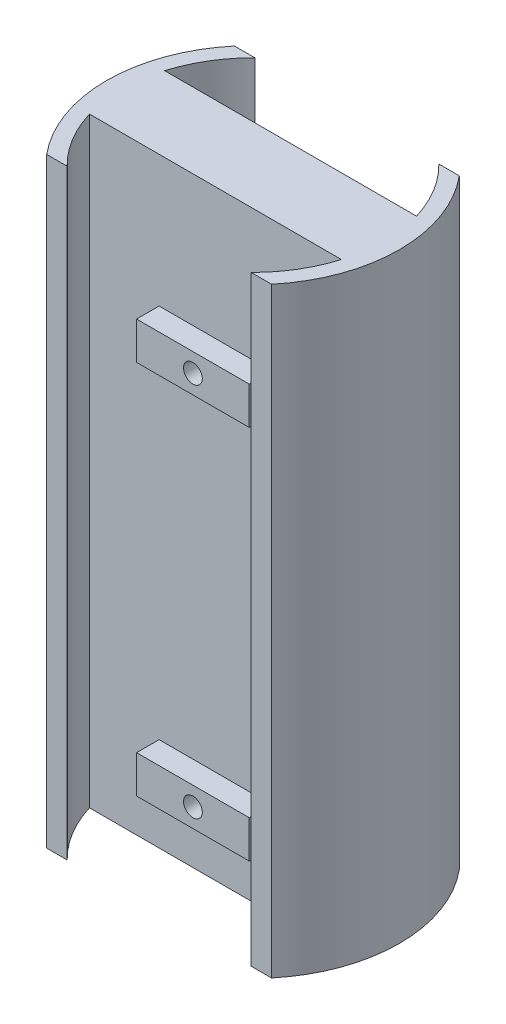
ISO-10303-21;
HEADER;
FILE_DESCRIPTION(('STEP AP214'),'2;1');
FILE_NAME('part.step','',(''),(''),'','','');
FILE_SCHEMA(('AUTOMOTIVE_DESIGN { 1 0 10303 214 1 1 1 1 }'));
ENDSEC;
DATA;
#1=APPLICATION_CONTEXT('core data for automotive mechanical design processes');
#2=APPLICATION_PROTOCOL_DEFINITION('international standard','automotive_design',2000,#1);
#3=PRODUCT_CONTEXT('',#1,'mechanical');
#4=PRODUCT('Part','Part','',(#3));
#5=PRODUCT_RELATED_PRODUCT_CATEGORY('part','',(#4));
#6=PRODUCT_DEFINITION_FORMATION('','',#4);
#7=PRODUCT_DEFINITION_CONTEXT('part definition',#1,'design');
#8=PRODUCT_DEFINITION('design','',#6,#7);
#9=PRODUCT_DEFINITION_SHAPE('','',#8);
#10=(LENGTH_UNIT() NAMED_UNIT(*) SI_UNIT(.MILLI.,.METRE.));
#11=(NAMED_UNIT(*) PLANE_ANGLE_UNIT() SI_UNIT($,.RADIAN.));
#12=(NAMED_UNIT(*) SI_UNIT($,.STERADIAN.) SOLID_ANGLE_UNIT());
#13=UNCERTAINTY_MEASURE_WITH_UNIT(LENGTH_MEASURE(1.E-05),#10,'distance_accuracy_value','');
#14=(GEOMETRIC_REPRESENTATION_CONTEXT(3) GLOBAL_UNCERTAINTY_ASSIGNED_CONTEXT((#13)) GLOBAL_UNIT_ASSIGNED_CONTEXT((#10,
#11,#12)) REPRESENTATION_CONTEXT('',''));
#15=CARTESIAN_POINT('',(0.,0.,0.));
#16=DIRECTION('',(0.,0.,1.));
#17=DIRECTION('',(1.,0.,0.));
#18=AXIS2_PLACEMENT_3D('',#15,#16,#17);
#19=CARTESIAN_POINT('',(49.53,-101.6,25.4));
#20=DIRECTION('',(0.,1.,0.));
#21=DIRECTION('',(0.,0.,1.));
#22=AXIS2_PLACEMENT_3D('',#19,#20,#21);
#23=PLANE('',#22);
#24=CARTESIAN_POINT('',(0.,-101.6,12.7));
#25=DIRECTION('',(0.,1.,0.));
#26=DIRECTION('',(0.,0.,1.));
#27=AXIS2_PLACEMENT_3D('',#24,#25,#26);
#28=CIRCLE('',#27,49.53);
#29=CARTESIAN_POINT('',(-38.0152390496232,-101.6,-19.05));
#30=VERTEX_POINT('',#29);
#31=CARTESIAN_POINT('',(-38.0152390496232,-101.6,44.45));
#32=VERTEX_POINT('',#31);
#33=EDGE_CURVE('E312',#30,#32,#28,.T.);
#34=ORIENTED_EDGE('',*,*,#33,.F.);
#35=DIRECTION('',(1.,0.,0.));
#36=VECTOR('',#35,1.);
#37=CARTESIAN_POINT('',(0.,-101.6,-19.05));
#38=LINE('',#37,#36);
#39=CARTESIAN_POINT('',(-31.1085197333464,-101.6,-19.05));
#40=VERTEX_POINT('',#39);
#41=EDGE_CURVE('E257',#30,#40,#38,.T.);
#42=ORIENTED_EDGE('',*,*,#41,.T.);
#43=CARTESIAN_POINT('',(0.,-101.6,12.7));
#44=DIRECTION('',(0.,1.,0.));
#45=DIRECTION('',(0.,0.,1.));
#46=AXIS2_PLACEMENT_3D('',#43,#44,#45);
#47=CIRCLE('',#46,44.45);
#48=CARTESIAN_POINT('',(-42.597094971371,-101.6,0.));
#49=VERTEX_POINT('',#48);
#50=EDGE_CURVE('E303',#40,#49,#47,.T.);
#51=ORIENTED_EDGE('',*,*,#50,.T.);
#52=DIRECTION('',(1.,0.,0.));
#53=VECTOR('',#52,1.);
#54=CARTESIAN_POINT('',(49.53,-101.6,0.));
#55=LINE('',#54,#53);
#56=CARTESIAN_POINT('',(42.597094971371,-101.6,0.));
#57=VERTEX_POINT('',#56);
#58=EDGE_CURVE('E330',#49,#57,#55,.T.);
#59=ORIENTED_EDGE('',*,*,#58,.T.);
#60=CARTESIAN_POINT('',(31.1085197333464,-101.6,-19.05));
#61=VERTEX_POINT('',#60);
#62=EDGE_CURVE('E305',#57,#61,#47,.T.);
#63=ORIENTED_EDGE('',*,*,#62,.T.);
#64=CARTESIAN_POINT('',(38.0152390496232,-101.6,-19.05));
#65=VERTEX_POINT('',#64);
#66=EDGE_CURVE('E262',#61,#65,#38,.T.);
#67=ORIENTED_EDGE('',*,*,#66,.T.);
#68=CARTESIAN_POINT('',(38.0152390496232,-101.6,44.45));
#69=VERTEX_POINT('',#68);
#70=EDGE_CURVE('E316',#69,#65,#28,.T.);
#71=ORIENTED_EDGE('',*,*,#70,.F.);
#72=DIRECTION('',(1.,0.,0.));
#73=VECTOR('',#72,1.);
#74=CARTESIAN_POINT('',(0.,-101.6,44.45));
#75=LINE('',#74,#73);
#76=CARTESIAN_POINT('',(31.1085197333464,-101.6,44.45));
#77=VERTEX_POINT('',#76);
#78=EDGE_CURVE('E261',#77,#69,#75,.T.);
#79=ORIENTED_EDGE('',*,*,#78,.F.);
#80=CARTESIAN_POINT('',(42.597094971371,-101.6,25.4));
#81=VERTEX_POINT('',#80);
#82=EDGE_CURVE('E304',#77,#81,#47,.T.);
#83=ORIENTED_EDGE('',*,*,#82,.T.);
#84=DIRECTION('',(1.,0.,0.));
#85=VECTOR('',#84,1.);
#86=CARTESIAN_POINT('',(49.53,-101.6,25.4));
#87=LINE('',#86,#85);
#88=CARTESIAN_POINT('',(-42.597094971371,-101.6,25.4));
#89=VERTEX_POINT('',#88);
#90=EDGE_CURVE('E331',#89,#81,#87,.T.);
#91=ORIENTED_EDGE('',*,*,#90,.F.);
#92=CARTESIAN_POINT('',(-31.1085197333464,-101.6,44.45));
#93=VERTEX_POINT('',#92);
#94=EDGE_CURVE('E299',#89,#93,#47,.T.);
#95=ORIENTED_EDGE('',*,*,#94,.T.);
#96=EDGE_CURVE('E263',#32,#93,#75,.T.);
#97=ORIENTED_EDGE('',*,*,#96,.F.);
#98=EDGE_LOOP('',(#34,#42,#51,#59,#63,#67,#71,#79,#83,#91,#95,#97));
#99=FACE_BOUND('',#98,.T.);
#100=ADVANCED_FACE('F41',(#99),#23,.F.);
#101=CARTESIAN_POINT('',(49.53,101.6,25.4));
#102=DIRECTION('',(0.,-1.,0.));
#103=DIRECTION('',(0.,0.,-1.));
#104=AXIS2_PLACEMENT_3D('',#101,#102,#103);
#105=PLANE('',#104);
#106=CARTESIAN_POINT('',(0.,101.6,12.7));
#107=DIRECTION('',(0.,1.,0.));
#108=DIRECTION('',(0.,0.,1.));
#109=AXIS2_PLACEMENT_3D('',#106,#107,#108);
#110=CIRCLE('',#109,49.53);
#111=CARTESIAN_POINT('',(38.0152390496232,101.6,44.45));
#112=VERTEX_POINT('',#111);
#113=CARTESIAN_POINT('',(38.0152390496232,101.6,-19.05));
#114=VERTEX_POINT('',#113);
#115=EDGE_CURVE('E317',#112,#114,#110,.T.);
#116=ORIENTED_EDGE('',*,*,#115,.T.);
#117=DIRECTION('',(1.,0.,0.));
#118=VECTOR('',#117,1.);
#119=CARTESIAN_POINT('',(0.,101.6,-19.05));
#120=LINE('',#119,#118);
#121=CARTESIAN_POINT('',(31.1085197333464,101.6,-19.05));
#122=VERTEX_POINT('',#121);
#123=EDGE_CURVE('E256',#122,#114,#120,.T.);
#124=ORIENTED_EDGE('',*,*,#123,.F.);
#125=CARTESIAN_POINT('',(0.,101.6,12.7));
#126=DIRECTION('',(0.,1.,0.));
#127=DIRECTION('',(0.,0.,1.));
#128=AXIS2_PLACEMENT_3D('',#125,#126,#127);
#129=CIRCLE('',#128,44.45);
#130=CARTESIAN_POINT('',(42.597094971371,101.6,0.));
#131=VERTEX_POINT('',#130);
#132=EDGE_CURVE('E311',#131,#122,#129,.T.);
#133=ORIENTED_EDGE('',*,*,#132,.F.);
#134=DIRECTION('',(-1.,0.,0.));
#135=VECTOR('',#134,1.);
#136=CARTESIAN_POINT('',(49.53,101.6,0.));
#137=LINE('',#136,#135);
#138=CARTESIAN_POINT('',(-42.597094971371,101.6,0.));
#139=VERTEX_POINT('',#138);
#140=EDGE_CURVE('E336',#131,#139,#137,.T.);
#141=ORIENTED_EDGE('',*,*,#140,.T.);
#142=CARTESIAN_POINT('',(-31.1085197333464,101.6,-19.05));
#143=VERTEX_POINT('',#142);
#144=EDGE_CURVE('E310',#143,#139,#129,.T.);
#145=ORIENTED_EDGE('',*,*,#144,.F.);
#146=CARTESIAN_POINT('',(-38.0152390496232,101.6,-19.05));
#147=VERTEX_POINT('',#146);
#148=EDGE_CURVE('E267',#147,#143,#120,.T.);
#149=ORIENTED_EDGE('',*,*,#148,.F.);
#150=CARTESIAN_POINT('',(-38.0152390496232,101.6,44.45));
#151=VERTEX_POINT('',#150);
#152=EDGE_CURVE('E318',#147,#151,#110,.T.);
#153=ORIENTED_EDGE('',*,*,#152,.T.);
#154=DIRECTION('',(1.,0.,0.));
#155=VECTOR('',#154,1.);
#156=CARTESIAN_POINT('',(0.,101.6,44.45));
#157=LINE('',#156,#155);
#158=CARTESIAN_POINT('',(-31.1085197333464,101.6,44.45));
#159=VERTEX_POINT('',#158);
#160=EDGE_CURVE('E271',#151,#159,#157,.T.);
#161=ORIENTED_EDGE('',*,*,#160,.T.);
#162=CARTESIAN_POINT('',(-42.597094971371,101.6,25.4));
#163=VERTEX_POINT('',#162);
#164=EDGE_CURVE('E306',#163,#159,#129,.T.);
#165=ORIENTED_EDGE('',*,*,#164,.F.);
#166=DIRECTION('',(-1.,0.,0.));
#167=VECTOR('',#166,1.);
#168=CARTESIAN_POINT('',(49.53,101.6,25.4));
#169=LINE('',#168,#167);
#170=CARTESIAN_POINT('',(42.597094971371,101.6,25.4));
#171=VERTEX_POINT('',#170);
#172=EDGE_CURVE('E335',#171,#163,#169,.T.);
#173=ORIENTED_EDGE('',*,*,#172,.F.);
#174=CARTESIAN_POINT('',(31.1085197333464,101.6,44.45));
#175=VERTEX_POINT('',#174);
#176=EDGE_CURVE('E298',#175,#171,#129,.T.);
#177=ORIENTED_EDGE('',*,*,#176,.F.);
#178=EDGE_CURVE('E270',#175,#112,#157,.T.);
#179=ORIENTED_EDGE('',*,*,#178,.T.);
#180=EDGE_LOOP('',(#116,#124,#133,#141,#145,#149,#153,#161,#165,#173,#177,#179));
#181=FACE_BOUND('',#180,.T.);
#182=ADVANCED_FACE('F388',(#181),#105,.F.);
#183=CARTESIAN_POINT('',(0.,-101.6,12.7));
#184=DIRECTION('',(0.,1.,0.));
#185=DIRECTION('',(0.,0.,1.));
#186=AXIS2_PLACEMENT_3D('',#183,#184,#185);
#187=CYLINDRICAL_SURFACE('',#186,44.45);
#188=ORIENTED_EDGE('',*,*,#132,.T.);
#189=DIRECTION('',(0.,1.,0.));
#190=VECTOR('',#189,1.);
#191=CARTESIAN_POINT('',(31.1085197333464,-101.6,-19.05));
#192=LINE('',#191,#190);
#193=EDGE_CURVE('E294',#122,#61,#192,.F.);
#194=ORIENTED_EDGE('',*,*,#193,.T.);
#195=ORIENTED_EDGE('',*,*,#62,.F.);
#196=DIRECTION('',(0.,1.,0.));
#197=VECTOR('',#196,1.);
#198=CARTESIAN_POINT('',(42.597094971371,-101.6,0.));
#199=LINE('',#198,#197);
#200=EDGE_CURVE('E350',#57,#131,#199,.T.);
#201=ORIENTED_EDGE('',*,*,#200,.T.);
#202=EDGE_LOOP('',(#188,#194,#195,#201));
#203=FACE_BOUND('',#202,.T.);
#204=ADVANCED_FACE('F393',(#203),#187,.F.);
#205=CARTESIAN_POINT('',(0.,-101.6,12.7));
#206=DIRECTION('',(0.,1.,0.));
#207=DIRECTION('',(0.,0.,1.));
#208=AXIS2_PLACEMENT_3D('',#205,#206,#207);
#209=CYLINDRICAL_SURFACE('',#208,49.53);
#210=ORIENTED_EDGE('',*,*,#115,.F.);
#211=DIRECTION('',(0.,1.,0.));
#212=VECTOR('',#211,1.);
#213=CARTESIAN_POINT('',(38.0152390496232,-101.6,44.45));
#214=LINE('',#213,#212);
#215=EDGE_CURVE('E284',#69,#112,#214,.T.);
#216=ORIENTED_EDGE('',*,*,#215,.F.);
#217=ORIENTED_EDGE('',*,*,#70,.T.);
#218=DIRECTION('',(0.,1.,0.));
#219=VECTOR('',#218,1.);
#220=CARTESIAN_POINT('',(38.0152390496232,-101.6,-19.05));
#221=LINE('',#220,#219);
#222=EDGE_CURVE('E266',#65,#114,#221,.T.);
#223=ORIENTED_EDGE('',*,*,#222,.T.);
#224=EDGE_LOOP('',(#210,#216,#217,#223));
#225=FACE_BOUND('',#224,.T.);
#226=ADVANCED_FACE('F444',(#225),#209,.T.);
#227=DIRECTION('',(0.,1.,0.));
#228=VECTOR('',#227,1.);
#229=CARTESIAN_POINT('',(31.1085197333464,-101.6,44.45));
#230=LINE('',#229,#228);
#231=EDGE_CURVE('E357',#175,#77,#230,.F.);
#232=ORIENTED_EDGE('',*,*,#231,.F.);
#233=ORIENTED_EDGE('',*,*,#176,.T.);
#234=DIRECTION('',(0.,1.,0.));
#235=VECTOR('',#234,1.);
#236=CARTESIAN_POINT('',(42.597094971371,-101.6,25.4));
#237=LINE('',#236,#235);
#238=EDGE_CURVE('E326',#81,#171,#237,.T.);
#239=ORIENTED_EDGE('',*,*,#238,.F.);
#240=ORIENTED_EDGE('',*,*,#82,.F.);
#241=EDGE_LOOP('',(#232,#233,#239,#240));
#242=FACE_BOUND('',#241,.T.);
#243=ADVANCED_FACE('F428',(#242),#187,.F.);
#244=DIRECTION('',(0.,1.,0.));
#245=VECTOR('',#244,1.);
#246=CARTESIAN_POINT('',(-31.1085197333464,-101.6,44.45));
#247=LINE('',#246,#245);
#248=EDGE_CURVE('E354',#93,#159,#247,.T.);
#249=ORIENTED_EDGE('',*,*,#248,.F.);
#250=ORIENTED_EDGE('',*,*,#94,.F.);
#251=DIRECTION('',(0.,1.,0.));
#252=VECTOR('',#251,1.);
#253=CARTESIAN_POINT('',(-42.597094971371,-101.6,25.4));
#254=LINE('',#253,#252);
#255=EDGE_CURVE('E322',#163,#89,#254,.F.);
#256=ORIENTED_EDGE('',*,*,#255,.F.);
#257=ORIENTED_EDGE('',*,*,#164,.T.);
#258=EDGE_LOOP('',(#249,#250,#256,#257));
#259=FACE_BOUND('',#258,.T.);
#260=ADVANCED_FACE('F382',(#259),#187,.F.);
#261=CARTESIAN_POINT('',(0.,0.,25.4));
#262=DIRECTION('',(0.,0.,1.));
#263=DIRECTION('',(1.,0.,0.));
#264=AXIS2_PLACEMENT_3D('',#261,#262,#263);
#265=PLANE('',#264);
#266=DIRECTION('',(-1.,0.,0.));
#267=VECTOR('',#266,1.);
#268=CARTESIAN_POINT('',(-19.05,-69.85,25.4));
#269=LINE('',#268,#267);
#270=CARTESIAN_POINT('',(19.05,-69.85,25.4));
#271=VERTEX_POINT('',#270);
#272=CARTESIAN_POINT('',(-19.05,-69.85,25.4));
#273=VERTEX_POINT('',#272);
#274=EDGE_CURVE('E616',#271,#273,#269,.T.);
#275=ORIENTED_EDGE('',*,*,#274,.F.);
#276=DIRECTION('',(0.,1.,0.));
#277=VECTOR('',#276,1.);
#278=CARTESIAN_POINT('',(19.05,-82.55,25.4));
#279=LINE('',#278,#277);
#280=CARTESIAN_POINT('',(19.05,-82.55,25.4));
#281=VERTEX_POINT('',#280);
#282=EDGE_CURVE('E205',#281,#271,#279,.T.);
#283=ORIENTED_EDGE('',*,*,#282,.F.);
#284=DIRECTION('',(1.,0.,0.));
#285=VECTOR('',#284,1.);
#286=CARTESIAN_POINT('',(-19.05,-82.55,25.4));
#287=LINE('',#286,#285);
#288=CARTESIAN_POINT('',(-19.05,-82.55,25.4));
#289=VERTEX_POINT('',#288);
#290=EDGE_CURVE('E201',#289,#281,#287,.T.);
#291=ORIENTED_EDGE('',*,*,#290,.F.);
#292=DIRECTION('',(0.,-1.,0.));
#293=VECTOR('',#292,1.);
#294=CARTESIAN_POINT('',(-19.05,-82.55,25.4));
#295=LINE('',#294,#293);
#296=EDGE_CURVE('E626',#273,#289,#295,.T.);
#297=ORIENTED_EDGE('',*,*,#296,.F.);
#298=EDGE_LOOP('',(#275,#283,#291,#297));
#299=FACE_BOUND('',#298,.T.);
#300=DIRECTION('',(-1.,0.,0.));
#301=VECTOR('',#300,1.);
#302=CARTESIAN_POINT('',(-19.05,57.15,25.4));
#303=LINE('',#302,#301);
#304=CARTESIAN_POINT('',(19.05,57.15,25.4));
#305=VERTEX_POINT('',#304);
#306=CARTESIAN_POINT('',(-19.05,57.15,25.4));
#307=VERTEX_POINT('',#306);
#308=EDGE_CURVE('E236',#305,#307,#303,.T.);
#309=ORIENTED_EDGE('',*,*,#308,.F.);
#310=DIRECTION('',(0.,1.,0.));
#311=VECTOR('',#310,1.);
#312=CARTESIAN_POINT('',(19.05,44.45,25.4));
#313=LINE('',#312,#311);
#314=CARTESIAN_POINT('',(19.05,44.45,25.4));
#315=VERTEX_POINT('',#314);
#316=EDGE_CURVE('E213',#315,#305,#313,.T.);
#317=ORIENTED_EDGE('',*,*,#316,.F.);
#318=DIRECTION('',(1.,0.,0.));
#319=VECTOR('',#318,1.);
#320=CARTESIAN_POINT('',(-19.05,44.45,25.4));
#321=LINE('',#320,#319);
#322=CARTESIAN_POINT('',(-19.05,44.45,25.4));
#323=VERTEX_POINT('',#322);
#324=EDGE_CURVE('E223',#323,#315,#321,.T.);
#325=ORIENTED_EDGE('',*,*,#324,.F.);
#326=DIRECTION('',(0.,-1.,0.));
#327=VECTOR('',#326,1.);
#328=CARTESIAN_POINT('',(-19.05,44.45,25.4));
#329=LINE('',#328,#327);
#330=EDGE_CURVE('E239',#307,#323,#329,.T.);
#331=ORIENTED_EDGE('',*,*,#330,.F.);
#332=EDGE_LOOP('',(#309,#317,#325,#331));
#333=FACE_BOUND('',#332,.T.);
#334=ORIENTED_EDGE('',*,*,#90,.T.);
#335=ORIENTED_EDGE('',*,*,#238,.T.);
#336=ORIENTED_EDGE('',*,*,#172,.T.);
#337=ORIENTED_EDGE('',*,*,#255,.T.);
#338=EDGE_LOOP('',(#334,#335,#336,#337));
#339=FACE_BOUND('',#338,.T.);
#340=ADVANCED_FACE('F368',(#299,#333,#339),#265,.T.);
#341=CARTESIAN_POINT('',(0.,0.,0.));
#342=DIRECTION('',(0.,0.,1.));
#343=DIRECTION('',(1.,0.,0.));
#344=AXIS2_PLACEMENT_3D('',#341,#342,#343);
#345=PLANE('',#344);
#346=ORIENTED_EDGE('',*,*,#200,.F.);
#347=ORIENTED_EDGE('',*,*,#58,.F.);
#348=DIRECTION('',(0.,1.,0.));
#349=VECTOR('',#348,1.);
#350=CARTESIAN_POINT('',(-42.597094971371,-101.6,0.));
#351=LINE('',#350,#349);
#352=EDGE_CURVE('E340',#139,#49,#351,.F.);
#353=ORIENTED_EDGE('',*,*,#352,.F.);
#354=ORIENTED_EDGE('',*,*,#140,.F.);
#355=EDGE_LOOP('',(#346,#347,#353,#354));
#356=FACE_BOUND('',#355,.T.);
#357=ADVANCED_FACE('F381',(#356),#345,.F.);
#358=ORIENTED_EDGE('',*,*,#50,.F.);
#359=DIRECTION('',(0.,1.,0.));
#360=VECTOR('',#359,1.);
#361=CARTESIAN_POINT('',(-31.1085197333464,-101.6,-19.05));
#362=LINE('',#361,#360);
#363=EDGE_CURVE('E279',#40,#143,#362,.T.);
#364=ORIENTED_EDGE('',*,*,#363,.T.);
#365=ORIENTED_EDGE('',*,*,#144,.T.);
#366=ORIENTED_EDGE('',*,*,#352,.T.);
#367=EDGE_LOOP('',(#358,#364,#365,#366));
#368=FACE_BOUND('',#367,.T.);
#369=ADVANCED_FACE('F408',(#368),#187,.F.);
#370=DIRECTION('',(0.,1.,0.));
#371=VECTOR('',#370,1.);
#372=CARTESIAN_POINT('',(-38.0152390496232,-101.6,-19.05));
#373=LINE('',#372,#371);
#374=EDGE_CURVE('E275',#30,#147,#373,.T.);
#375=ORIENTED_EDGE('',*,*,#374,.F.);
#376=ORIENTED_EDGE('',*,*,#33,.T.);
#377=DIRECTION('',(0.,1.,0.));
#378=VECTOR('',#377,1.);
#379=CARTESIAN_POINT('',(-38.0152390496232,-101.6,44.45));
#380=LINE('',#379,#378);
#381=EDGE_CURVE('E280',#32,#151,#380,.T.);
#382=ORIENTED_EDGE('',*,*,#381,.T.);
#383=ORIENTED_EDGE('',*,*,#152,.F.);
#384=EDGE_LOOP('',(#375,#376,#382,#383));
#385=FACE_BOUND('',#384,.T.);
#386=ADVANCED_FACE('F403',(#385),#209,.T.);
#387=CARTESIAN_POINT('',(0.,-101.6,44.45));
#388=DIRECTION('',(0.,0.,1.));
#389=DIRECTION('',(1.,0.,0.));
#390=AXIS2_PLACEMENT_3D('',#387,#388,#389);
#391=PLANE('',#390);
#392=ORIENTED_EDGE('',*,*,#248,.T.);
#393=ORIENTED_EDGE('',*,*,#160,.F.);
#394=ORIENTED_EDGE('',*,*,#381,.F.);
#395=ORIENTED_EDGE('',*,*,#96,.T.);
#396=EDGE_LOOP('',(#392,#393,#394,#395));
#397=FACE_BOUND('',#396,.T.);
#398=ADVANCED_FACE('F435',(#397),#391,.T.);
#399=ORIENTED_EDGE('',*,*,#231,.T.);
#400=ORIENTED_EDGE('',*,*,#78,.T.);
#401=ORIENTED_EDGE('',*,*,#215,.T.);
#402=ORIENTED_EDGE('',*,*,#178,.F.);
#403=EDGE_LOOP('',(#399,#400,#401,#402));
#404=FACE_BOUND('',#403,.T.);
#405=ADVANCED_FACE('F437',(#404),#391,.T.);
#406=CARTESIAN_POINT('',(0.,-101.6,-19.05));
#407=DIRECTION('',(0.,0.,1.));
#408=DIRECTION('',(1.,0.,0.));
#409=AXIS2_PLACEMENT_3D('',#406,#407,#408);
#410=PLANE('',#409);
#411=ORIENTED_EDGE('',*,*,#41,.F.);
#412=ORIENTED_EDGE('',*,*,#374,.T.);
#413=ORIENTED_EDGE('',*,*,#148,.T.);
#414=ORIENTED_EDGE('',*,*,#363,.F.);
#415=EDGE_LOOP('',(#411,#412,#413,#414));
#416=FACE_BOUND('',#415,.T.);
#417=ADVANCED_FACE('F401',(#416),#410,.F.);
#418=ORIENTED_EDGE('',*,*,#123,.T.);
#419=ORIENTED_EDGE('',*,*,#222,.F.);
#420=ORIENTED_EDGE('',*,*,#66,.F.);
#421=ORIENTED_EDGE('',*,*,#193,.F.);
#422=EDGE_LOOP('',(#418,#419,#420,#421));
#423=FACE_BOUND('',#422,.T.);
#424=ADVANCED_FACE('F449',(#423),#410,.F.);
#425=CARTESIAN_POINT('',(0.,0.,33.02));
#426=DIRECTION('',(0.,0.,-1.));
#427=DIRECTION('',(-1.,0.,0.));
#428=AXIS2_PLACEMENT_3D('',#425,#426,#427);
#429=PLANE('',#428);
#430=DIRECTION('',(0.,1.,0.));
#431=VECTOR('',#430,1.);
#432=CARTESIAN_POINT('',(19.05,44.45,33.02));
#433=LINE('',#432,#431);
#434=CARTESIAN_POINT('',(19.05,44.45,33.02));
#435=VERTEX_POINT('',#434);
#436=CARTESIAN_POINT('',(19.05,57.15,33.02));
#437=VERTEX_POINT('',#436);
#438=EDGE_CURVE('E218',#435,#437,#433,.T.);
#439=ORIENTED_EDGE('',*,*,#438,.T.);
#440=DIRECTION('',(-1.,0.,0.));
#441=VECTOR('',#440,1.);
#442=CARTESIAN_POINT('',(-19.05,57.15,33.02));
#443=LINE('',#442,#441);
#444=CARTESIAN_POINT('',(-19.05,57.15,33.02));
#445=VERTEX_POINT('',#444);
#446=EDGE_CURVE('E222',#437,#445,#443,.T.);
#447=ORIENTED_EDGE('',*,*,#446,.T.);
#448=DIRECTION('',(0.,-1.,0.));
#449=VECTOR('',#448,1.);
#450=CARTESIAN_POINT('',(-19.05,44.45,33.02));
#451=LINE('',#450,#449);
#452=CARTESIAN_POINT('',(-19.05,44.45,33.02));
#453=VERTEX_POINT('',#452);
#454=EDGE_CURVE('E226',#445,#453,#451,.T.);
#455=ORIENTED_EDGE('',*,*,#454,.T.);
#456=DIRECTION('',(1.,0.,0.));
#457=VECTOR('',#456,1.);
#458=CARTESIAN_POINT('',(-19.05,44.45,33.02));
#459=LINE('',#458,#457);
#460=EDGE_CURVE('E229',#453,#435,#459,.T.);
#461=ORIENTED_EDGE('',*,*,#460,.T.);
#462=EDGE_LOOP('',(#439,#447,#455,#461));
#463=FACE_BOUND('',#462,.T.);
#464=CARTESIAN_POINT('',(0.,50.8,33.02));
#465=DIRECTION('',(0.,0.,1.));
#466=DIRECTION('',(1.,0.,0.));
#467=AXIS2_PLACEMENT_3D('',#464,#465,#466);
#468=CIRCLE('',#467,3.175);
#469=CARTESIAN_POINT('',(-3.175,50.8,33.02));
#470=VERTEX_POINT('',#469);
#471=EDGE_CURVE('E208',#470,#470,#468,.T.);
#472=ORIENTED_EDGE('',*,*,#471,.F.);
#473=EDGE_LOOP('',(#472));
#474=FACE_BOUND('',#473,.T.);
#475=ADVANCED_FACE('F452',(#463,#474),#429,.F.);
#476=CARTESIAN_POINT('',(19.05,44.45,33.02));
#477=DIRECTION('',(-1.,0.,0.));
#478=DIRECTION('',(0.,0.,1.));
#479=AXIS2_PLACEMENT_3D('',#476,#477,#478);
#480=PLANE('',#479);
#481=ORIENTED_EDGE('',*,*,#316,.T.);
#482=DIRECTION('',(0.,0.,-1.));
#483=VECTOR('',#482,1.);
#484=CARTESIAN_POINT('',(19.05,57.15,33.02));
#485=LINE('',#484,#483);
#486=EDGE_CURVE('E253',#437,#305,#485,.T.);
#487=ORIENTED_EDGE('',*,*,#486,.F.);
#488=ORIENTED_EDGE('',*,*,#438,.F.);
#489=DIRECTION('',(0.,0.,-1.));
#490=VECTOR('',#489,1.);
#491=CARTESIAN_POINT('',(19.05,44.45,33.02));
#492=LINE('',#491,#490);
#493=EDGE_CURVE('E232',#435,#315,#492,.T.);
#494=ORIENTED_EDGE('',*,*,#493,.T.);
#495=EDGE_LOOP('',(#481,#487,#488,#494));
#496=FACE_BOUND('',#495,.T.);
#497=ADVANCED_FACE('F447',(#496),#480,.F.);
#498=CARTESIAN_POINT('',(-19.05,57.15,33.02));
#499=DIRECTION('',(0.,-1.,0.));
#500=DIRECTION('',(0.,0.,-1.));
#501=AXIS2_PLACEMENT_3D('',#498,#499,#500);
#502=PLANE('',#501);
#503=ORIENTED_EDGE('',*,*,#308,.T.);
#504=DIRECTION('',(0.,0.,-1.));
#505=VECTOR('',#504,1.);
#506=CARTESIAN_POINT('',(-19.05,57.15,33.02));
#507=LINE('',#506,#505);
#508=EDGE_CURVE('E249',#445,#307,#507,.T.);
#509=ORIENTED_EDGE('',*,*,#508,.F.);
#510=ORIENTED_EDGE('',*,*,#446,.F.);
#511=ORIENTED_EDGE('',*,*,#486,.T.);
#512=EDGE_LOOP('',(#503,#509,#510,#511));
#513=FACE_BOUND('',#512,.T.);
#514=ADVANCED_FACE('F513',(#513),#502,.F.);
#515=CARTESIAN_POINT('',(-19.05,44.45,33.02));
#516=DIRECTION('',(1.,0.,0.));
#517=DIRECTION('',(0.,0.,-1.));
#518=AXIS2_PLACEMENT_3D('',#515,#516,#517);
#519=PLANE('',#518);
#520=ORIENTED_EDGE('',*,*,#330,.T.);
#521=DIRECTION('',(0.,0.,-1.));
#522=VECTOR('',#521,1.);
#523=CARTESIAN_POINT('',(-19.05,44.45,33.02));
#524=LINE('',#523,#522);
#525=EDGE_CURVE('E64',#453,#323,#524,.T.);
#526=ORIENTED_EDGE('',*,*,#525,.F.);
#527=ORIENTED_EDGE('',*,*,#454,.F.);
#528=ORIENTED_EDGE('',*,*,#508,.T.);
#529=EDGE_LOOP('',(#520,#526,#527,#528));
#530=FACE_BOUND('',#529,.T.);
#531=ADVANCED_FACE('F522',(#530),#519,.F.);
#532=CARTESIAN_POINT('',(-19.05,44.45,33.02));
#533=DIRECTION('',(0.,1.,0.));
#534=DIRECTION('',(0.,0.,1.));
#535=AXIS2_PLACEMENT_3D('',#532,#533,#534);
#536=PLANE('',#535);
#537=ORIENTED_EDGE('',*,*,#324,.T.);
#538=ORIENTED_EDGE('',*,*,#493,.F.);
#539=ORIENTED_EDGE('',*,*,#460,.F.);
#540=ORIENTED_EDGE('',*,*,#525,.T.);
#541=EDGE_LOOP('',(#537,#538,#539,#540));
#542=FACE_BOUND('',#541,.T.);
#543=ADVANCED_FACE('F375',(#542),#536,.F.);
#544=CARTESIAN_POINT('',(0.,50.8,33.02));
#545=DIRECTION('',(0.,0.,-1.));
#546=DIRECTION('',(-1.,0.,0.));
#547=AXIS2_PLACEMENT_3D('',#544,#545,#546);
#548=CYLINDRICAL_SURFACE('',#547,3.175);
#549=CARTESIAN_POINT('',(0.,50.8,25.4));
#550=DIRECTION('',(0.,0.,1.));
#551=DIRECTION('',(1.,0.,0.));
#552=AXIS2_PLACEMENT_3D('',#549,#550,#551);
#553=CIRCLE('',#552,3.175);
#554=CARTESIAN_POINT('',(-3.175,50.8,25.4));
#555=VERTEX_POINT('',#554);
#556=EDGE_CURVE('E49',#555,#555,#553,.F.);
#557=CARTESIAN_POINT('',(-3.175,50.8,33.02));
#558=CARTESIAN_POINT('',(-3.175,50.8,32.940625));
#559=CARTESIAN_POINT('',(-3.175,50.8,32.86125));
#560=CARTESIAN_POINT('',(-3.175,50.8,32.7025));
#561=CARTESIAN_POINT('',(-3.175,50.8,32.623125));
#562=CARTESIAN_POINT('',(-3.175,50.8,32.464375));
#563=CARTESIAN_POINT('',(-3.175,50.8,32.385));
#564=CARTESIAN_POINT('',(-3.175,50.8,32.22625));
#565=CARTESIAN_POINT('',(-3.175,50.8,32.146875));
#566=CARTESIAN_POINT('',(-3.175,50.8,31.988125));
#567=CARTESIAN_POINT('',(-3.175,50.8,31.90875));
#568=CARTESIAN_POINT('',(-3.175,50.8,31.75));
#569=CARTESIAN_POINT('',(-3.175,50.8,31.670625));
#570=CARTESIAN_POINT('',(-3.175,50.8,31.511875));
#571=CARTESIAN_POINT('',(-3.175,50.8,31.4325));
#572=CARTESIAN_POINT('',(-3.175,50.8,31.27375));
#573=CARTESIAN_POINT('',(-3.175,50.8,31.194375));
#574=CARTESIAN_POINT('',(-3.175,50.8,31.035625));
#575=CARTESIAN_POINT('',(-3.175,50.8,30.95625));
#576=CARTESIAN_POINT('',(-3.175,50.8,30.7975));
#577=CARTESIAN_POINT('',(-3.175,50.8,30.718125));
#578=CARTESIAN_POINT('',(-3.175,50.8,30.559375));
#579=CARTESIAN_POINT('',(-3.175,50.8,30.48));
#580=CARTESIAN_POINT('',(-3.175,50.8,30.32125));
#581=CARTESIAN_POINT('',(-3.175,50.8,30.241875));
#582=CARTESIAN_POINT('',(-3.175,50.8,30.083125));
#583=CARTESIAN_POINT('',(-3.175,50.8,30.00375));
#584=CARTESIAN_POINT('',(-3.175,50.8,29.845));
#585=CARTESIAN_POINT('',(-3.175,50.8,29.765625));
#586=CARTESIAN_POINT('',(-3.175,50.8,29.606875));
#587=CARTESIAN_POINT('',(-3.175,50.8,29.5275));
#588=CARTESIAN_POINT('',(-3.175,50.8,29.36875));
#589=CARTESIAN_POINT('',(-3.175,50.8,29.289375));
#590=CARTESIAN_POINT('',(-3.175,50.8,29.130625));
#591=CARTESIAN_POINT('',(-3.175,50.8,29.05125));
#592=CARTESIAN_POINT('',(-3.175,50.8,28.8925));
#593=CARTESIAN_POINT('',(-3.175,50.8,28.813125));
#594=CARTESIAN_POINT('',(-3.175,50.8,28.654375));
#595=CARTESIAN_POINT('',(-3.175,50.8,28.575));
#596=CARTESIAN_POINT('',(-3.175,50.8,28.41625));
#597=CARTESIAN_POINT('',(-3.175,50.8,28.336875));
#598=CARTESIAN_POINT('',(-3.175,50.8,28.178125));
#599=CARTESIAN_POINT('',(-3.175,50.8,28.09875));
#600=CARTESIAN_POINT('',(-3.175,50.8,27.94));
#601=CARTESIAN_POINT('',(-3.175,50.8,27.860625));
#602=CARTESIAN_POINT('',(-3.175,50.8,27.701875));
#603=CARTESIAN_POINT('',(-3.175,50.8,27.6225));
#604=CARTESIAN_POINT('',(-3.175,50.8,27.46375));
#605=CARTESIAN_POINT('',(-3.175,50.8,27.384375));
#606=CARTESIAN_POINT('',(-3.175,50.8,27.225625));
#607=CARTESIAN_POINT('',(-3.175,50.8,27.14625));
#608=CARTESIAN_POINT('',(-3.175,50.8,26.9875));
#609=CARTESIAN_POINT('',(-3.175,50.8,26.908125));
#610=CARTESIAN_POINT('',(-3.175,50.8,26.749375));
#611=CARTESIAN_POINT('',(-3.175,50.8,26.67));
#612=CARTESIAN_POINT('',(-3.175,50.8,26.51125));
#613=CARTESIAN_POINT('',(-3.175,50.8,26.431875));
#614=CARTESIAN_POINT('',(-3.175,50.8,26.273125));
#615=CARTESIAN_POINT('',(-3.175,50.8,26.19375));
#616=CARTESIAN_POINT('',(-3.175,50.8,26.035));
#617=CARTESIAN_POINT('',(-3.175,50.8,25.955625));
#618=CARTESIAN_POINT('',(-3.175,50.8,25.796875));
#619=CARTESIAN_POINT('',(-3.175,50.8,25.7175));
#620=CARTESIAN_POINT('',(-3.175,50.8,25.55875));
#621=CARTESIAN_POINT('',(-3.175,50.8,25.479375));
#622=CARTESIAN_POINT('',(-3.175,50.8,25.4));
#623=B_SPLINE_CURVE_WITH_KNOTS('',3,(#557,#558,#559,#560,#561,#562,#563,#564,#565,#566,#567,
#568,#569,#570,#571,#572,#573,#574,#575,#576,#577,#578,#579,#580,#581,#582,#583,#584,#585,#586,
#587,#588,#589,#590,#591,#592,#593,#594,#595,#596,#597,#598,#599,#600,#601,#602,#603,#604,#605,
#606,#607,#608,#609,#610,#611,#612,#613,#614,#615,#616,#617,#618,#619,#620,#621,#622),
.UNSPECIFIED.,.F.,.F.,(4,2,2,2,2,2,2,2,2,2,2,2,2,2,2,2,2,2,2,2,2,2,2,2,2,2,2,2,2,2,2,2,4),(0.,
0.238124999999999,0.476249999999998,0.714374999999996,0.952499999999995,1.19062499999999,
1.42875,1.666875,1.905,2.143125,2.38125,2.619375,2.8575,3.095625,3.33375,3.571875,3.81,4.048125,
4.28625,4.524375,4.7625,5.000625,5.23875,5.476875,5.715,5.953125,6.19125,6.429375,6.6675,
6.905625,7.14375,7.381875,7.62),.UNSPECIFIED.);
#624=EDGE_CURVE('BSEAM363',#470,#555,#623,.T.);
#625=ORIENTED_EDGE('',*,*,#471,.T.);
#626=ORIENTED_EDGE('',*,*,#556,.T.);
#627=ORIENTED_EDGE('',*,*,#624,.T.);
#628=ORIENTED_EDGE('',*,*,#624,.F.);
#629=EDGE_LOOP('',(#625,#627,#626,#628));
#630=FACE_BOUND('',#629,.T.);
#631=ADVANCED_FACE('F363',(#630),#548,.F.);
#632=ORIENTED_EDGE('',*,*,#556,.F.);
#633=EDGE_LOOP('',(#632));
#634=FACE_BOUND('',#633,.T.);
#635=ADVANCED_FACE('F365',(#634),#265,.T.);
#636=CARTESIAN_POINT('',(0.,0.,33.02));
#637=DIRECTION('',(0.,0.,-1.));
#638=DIRECTION('',(-1.,0.,0.));
#639=AXIS2_PLACEMENT_3D('',#636,#637,#638);
#640=PLANE('',#639);
#641=DIRECTION('',(0.,1.,0.));
#642=VECTOR('',#641,1.);
#643=CARTESIAN_POINT('',(19.05,-82.55,33.02));
#644=LINE('',#643,#642);
#645=CARTESIAN_POINT('',(19.05,-82.55,33.02));
#646=VERTEX_POINT('',#645);
#647=CARTESIAN_POINT('',(19.05,-69.85,33.02));
#648=VERTEX_POINT('',#647);
#649=EDGE_CURVE('E191',#646,#648,#644,.T.);
#650=ORIENTED_EDGE('',*,*,#649,.T.);
#651=DIRECTION('',(-1.,0.,0.));
#652=VECTOR('',#651,1.);
#653=CARTESIAN_POINT('',(-19.05,-69.85,33.02));
#654=LINE('',#653,#652);
#655=CARTESIAN_POINT('',(-19.05,-69.85,33.02));
#656=VERTEX_POINT('',#655);
#657=EDGE_CURVE('E179',#648,#656,#654,.T.);
#658=ORIENTED_EDGE('',*,*,#657,.T.);
#659=DIRECTION('',(0.,-1.,0.));
#660=VECTOR('',#659,1.);
#661=CARTESIAN_POINT('',(-19.05,-82.55,33.02));
#662=LINE('',#661,#660);
#663=CARTESIAN_POINT('',(-19.05,-82.55,33.02));
#664=VERTEX_POINT('',#663);
#665=EDGE_CURVE('E190',#656,#664,#662,.T.);
#666=ORIENTED_EDGE('',*,*,#665,.T.);
#667=DIRECTION('',(1.,0.,0.));
#668=VECTOR('',#667,1.);
#669=CARTESIAN_POINT('',(-19.05,-82.55,33.02));
#670=LINE('',#669,#668);
#671=EDGE_CURVE('E196',#664,#646,#670,.T.);
#672=ORIENTED_EDGE('',*,*,#671,.T.);
#673=EDGE_LOOP('',(#650,#658,#666,#672));
#674=FACE_BOUND('',#673,.T.);
#675=CARTESIAN_POINT('',(0.,-76.2,33.02));
#676=DIRECTION('',(0.,0.,1.));
#677=DIRECTION('',(1.,0.,0.));
#678=AXIS2_PLACEMENT_3D('',#675,#676,#677);
#679=CIRCLE('',#678,3.175);
#680=CARTESIAN_POINT('',(-3.175,-76.2,33.02));
#681=VERTEX_POINT('',#680);
#682=EDGE_CURVE('E611',#681,#681,#679,.T.);
#683=ORIENTED_EDGE('',*,*,#682,.F.);
#684=EDGE_LOOP('',(#683));
#685=FACE_BOUND('',#684,.T.);
#686=ADVANCED_FACE('F194',(#674,#685),#640,.F.);
#687=CARTESIAN_POINT('',(19.05,-82.55,33.02));
#688=DIRECTION('',(-1.,0.,0.));
#689=DIRECTION('',(0.,0.,1.));
#690=AXIS2_PLACEMENT_3D('',#687,#688,#689);
#691=PLANE('',#690);
#692=ORIENTED_EDGE('',*,*,#282,.T.);
#693=DIRECTION('',(0.,0.,-1.));
#694=VECTOR('',#693,1.);
#695=CARTESIAN_POINT('',(19.05,-69.85,33.02));
#696=LINE('',#695,#694);
#697=EDGE_CURVE('E183',#648,#271,#696,.T.);
#698=ORIENTED_EDGE('',*,*,#697,.F.);
#699=ORIENTED_EDGE('',*,*,#649,.F.);
#700=DIRECTION('',(0.,0.,-1.));
#701=VECTOR('',#700,1.);
#702=CARTESIAN_POINT('',(19.05,-82.55,33.02));
#703=LINE('',#702,#701);
#704=EDGE_CURVE('E622',#646,#281,#703,.T.);
#705=ORIENTED_EDGE('',*,*,#704,.T.);
#706=EDGE_LOOP('',(#692,#698,#699,#705));
#707=FACE_BOUND('',#706,.T.);
#708=ADVANCED_FACE('F203',(#707),#691,.F.);
#709=CARTESIAN_POINT('',(-19.05,-69.85,33.02));
#710=DIRECTION('',(0.,-1.,0.));
#711=DIRECTION('',(0.,0.,-1.));
#712=AXIS2_PLACEMENT_3D('',#709,#710,#711);
#713=PLANE('',#712);
#714=ORIENTED_EDGE('',*,*,#274,.T.);
#715=DIRECTION('',(0.,0.,-1.));
#716=VECTOR('',#715,1.);
#717=CARTESIAN_POINT('',(-19.05,-69.85,33.02));
#718=LINE('',#717,#716);
#719=EDGE_CURVE('E186',#656,#273,#718,.T.);
#720=ORIENTED_EDGE('',*,*,#719,.F.);
#721=ORIENTED_EDGE('',*,*,#657,.F.);
#722=ORIENTED_EDGE('',*,*,#697,.T.);
#723=EDGE_LOOP('',(#714,#720,#721,#722));
#724=FACE_BOUND('',#723,.T.);
#725=ADVANCED_FACE('F181',(#724),#713,.F.);
#726=CARTESIAN_POINT('',(-19.05,-82.55,33.02));
#727=DIRECTION('',(1.,0.,0.));
#728=DIRECTION('',(0.,0.,-1.));
#729=AXIS2_PLACEMENT_3D('',#726,#727,#728);
#730=PLANE('',#729);
#731=ORIENTED_EDGE('',*,*,#296,.T.);
#732=DIRECTION('',(0.,0.,-1.));
#733=VECTOR('',#732,1.);
#734=CARTESIAN_POINT('',(-19.05,-82.55,33.02));
#735=LINE('',#734,#733);
#736=EDGE_CURVE('E56',#664,#289,#735,.T.);
#737=ORIENTED_EDGE('',*,*,#736,.F.);
#738=ORIENTED_EDGE('',*,*,#665,.F.);
#739=ORIENTED_EDGE('',*,*,#719,.T.);
#740=EDGE_LOOP('',(#731,#737,#738,#739));
#741=FACE_BOUND('',#740,.T.);
#742=ADVANCED_FACE('F572',(#741),#730,.F.);
#743=CARTESIAN_POINT('',(-19.05,-82.55,33.02));
#744=DIRECTION('',(0.,1.,0.));
#745=DIRECTION('',(0.,0.,1.));
#746=AXIS2_PLACEMENT_3D('',#743,#744,#745);
#747=PLANE('',#746);
#748=ORIENTED_EDGE('',*,*,#290,.T.);
#749=ORIENTED_EDGE('',*,*,#704,.F.);
#750=ORIENTED_EDGE('',*,*,#671,.F.);
#751=ORIENTED_EDGE('',*,*,#736,.T.);
#752=EDGE_LOOP('',(#748,#749,#750,#751));
#753=FACE_BOUND('',#752,.T.);
#754=ADVANCED_FACE('F581',(#753),#747,.F.);
#755=CARTESIAN_POINT('',(0.,-76.2,33.02));
#756=DIRECTION('',(0.,0.,-1.));
#757=DIRECTION('',(-1.,0.,0.));
#758=AXIS2_PLACEMENT_3D('',#755,#756,#757);
#759=CYLINDRICAL_SURFACE('',#758,3.175);
#760=CARTESIAN_POINT('',(0.,-76.2,25.4));
#761=DIRECTION('',(0.,0.,1.));
#762=DIRECTION('',(1.,0.,0.));
#763=AXIS2_PLACEMENT_3D('',#760,#761,#762);
#764=CIRCLE('',#763,3.175);
#765=CARTESIAN_POINT('',(-3.175,-76.2,25.4));
#766=VERTEX_POINT('',#765);
#767=EDGE_CURVE('E11',#766,#766,#764,.F.);
#768=CARTESIAN_POINT('',(-3.175,-76.2,33.02));
#769=CARTESIAN_POINT('',(-3.175,-76.2,32.940625));
#770=CARTESIAN_POINT('',(-3.175,-76.2,32.86125));
#771=CARTESIAN_POINT('',(-3.175,-76.2,32.7025));
#772=CARTESIAN_POINT('',(-3.175,-76.2,32.623125));
#773=CARTESIAN_POINT('',(-3.175,-76.2,32.464375));
#774=CARTESIAN_POINT('',(-3.175,-76.2,32.385));
#775=CARTESIAN_POINT('',(-3.175,-76.2,32.22625));
#776=CARTESIAN_POINT('',(-3.175,-76.2,32.146875));
#777=CARTESIAN_POINT('',(-3.175,-76.2,31.988125));
#778=CARTESIAN_POINT('',(-3.175,-76.2,31.90875));
#779=CARTESIAN_POINT('',(-3.175,-76.2,31.75));
#780=CARTESIAN_POINT('',(-3.175,-76.2,31.670625));
#781=CARTESIAN_POINT('',(-3.175,-76.2,31.511875));
#782=CARTESIAN_POINT('',(-3.175,-76.2,31.4325));
#783=CARTESIAN_POINT('',(-3.175,-76.2,31.27375));
#784=CARTESIAN_POINT('',(-3.175,-76.2,31.194375));
#785=CARTESIAN_POINT('',(-3.175,-76.2,31.035625));
#786=CARTESIAN_POINT('',(-3.175,-76.2,30.95625));
#787=CARTESIAN_POINT('',(-3.175,-76.2,30.7975));
#788=CARTESIAN_POINT('',(-3.175,-76.2,30.718125));
#789=CARTESIAN_POINT('',(-3.175,-76.2,30.559375));
#790=CARTESIAN_POINT('',(-3.175,-76.2,30.48));
#791=CARTESIAN_POINT('',(-3.175,-76.2,30.32125));
#792=CARTESIAN_POINT('',(-3.175,-76.2,30.241875));
#793=CARTESIAN_POINT('',(-3.175,-76.2,30.083125));
#794=CARTESIAN_POINT('',(-3.175,-76.2,30.00375));
#795=CARTESIAN_POINT('',(-3.175,-76.2,29.845));
#796=CARTESIAN_POINT('',(-3.175,-76.2,29.765625));
#797=CARTESIAN_POINT('',(-3.175,-76.2,29.606875));
#798=CARTESIAN_POINT('',(-3.175,-76.2,29.5275));
#799=CARTESIAN_POINT('',(-3.175,-76.2,29.36875));
#800=CARTESIAN_POINT('',(-3.175,-76.2,29.289375));
#801=CARTESIAN_POINT('',(-3.175,-76.2,29.130625));
#802=CARTESIAN_POINT('',(-3.175,-76.2,29.05125));
#803=CARTESIAN_POINT('',(-3.175,-76.2,28.8925));
#804=CARTESIAN_POINT('',(-3.175,-76.2,28.813125));
#805=CARTESIAN_POINT('',(-3.175,-76.2,28.654375));
#806=CARTESIAN_POINT('',(-3.175,-76.2,28.575));
#807=CARTESIAN_POINT('',(-3.175,-76.2,28.41625));
#808=CARTESIAN_POINT('',(-3.175,-76.2,28.336875));
#809=CARTESIAN_POINT('',(-3.175,-76.2,28.178125));
#810=CARTESIAN_POINT('',(-3.175,-76.2,28.09875));
#811=CARTESIAN_POINT('',(-3.175,-76.2,27.94));
#812=CARTESIAN_POINT('',(-3.175,-76.2,27.860625));
#813=CARTESIAN_POINT('',(-3.175,-76.2,27.701875));
#814=CARTESIAN_POINT('',(-3.175,-76.2,27.6225));
#815=CARTESIAN_POINT('',(-3.175,-76.2,27.46375));
#816=CARTESIAN_POINT('',(-3.175,-76.2,27.384375));
#817=CARTESIAN_POINT('',(-3.175,-76.2,27.225625));
#818=CARTESIAN_POINT('',(-3.175,-76.2,27.14625));
#819=CARTESIAN_POINT('',(-3.175,-76.2,26.9875));
#820=CARTESIAN_POINT('',(-3.175,-76.2,26.908125));
#821=CARTESIAN_POINT('',(-3.175,-76.2,26.749375));
#822=CARTESIAN_POINT('',(-3.175,-76.2,26.67));
#823=CARTESIAN_POINT('',(-3.175,-76.2,26.51125));
#824=CARTESIAN_POINT('',(-3.175,-76.2,26.431875));
#825=CARTESIAN_POINT('',(-3.175,-76.2,26.273125));
#826=CARTESIAN_POINT('',(-3.175,-76.2,26.19375));
#827=CARTESIAN_POINT('',(-3.175,-76.2,26.035));
#828=CARTESIAN_POINT('',(-3.175,-76.2,25.955625));
#829=CARTESIAN_POINT('',(-3.175,-76.2,25.796875));
#830=CARTESIAN_POINT('',(-3.175,-76.2,25.7175));
#831=CARTESIAN_POINT('',(-3.175,-76.2,25.55875));
#832=CARTESIAN_POINT('',(-3.175,-76.2,25.479375));
#833=CARTESIAN_POINT('',(-3.175,-76.2,25.4));
#834=B_SPLINE_CURVE_WITH_KNOTS('',3,(#768,#769,#770,#771,#772,#773,#774,#775,#776,#777,#778,
#779,#780,#781,#782,#783,#784,#785,#786,#787,#788,#789,#790,#791,#792,#793,#794,#795,#796,#797,
#798,#799,#800,#801,#802,#803,#804,#805,#806,#807,#808,#809,#810,#811,#812,#813,#814,#815,#816,
#817,#818,#819,#820,#821,#822,#823,#824,#825,#826,#827,#828,#829,#830,#831,#832,#833),
.UNSPECIFIED.,.F.,.F.,(4,2,2,2,2,2,2,2,2,2,2,2,2,2,2,2,2,2,2,2,2,2,2,2,2,2,2,2,2,2,2,2,4),(0.,
0.238124999999999,0.476249999999998,0.714374999999996,0.952499999999995,1.19062499999999,
1.42875,1.666875,1.905,2.143125,2.38125,2.619375,2.8575,3.095625,3.33375,3.571875,3.81,4.048125,
4.28625,4.524375,4.7625,5.000625,5.23875,5.476875,5.715,5.953125,6.19125,6.429375,6.6675,
6.905625,7.14375,7.381875,7.62),.UNSPECIFIED.);
#835=EDGE_CURVE('BSEAM385',#681,#766,#834,.T.);
#836=ORIENTED_EDGE('',*,*,#682,.T.);
#837=ORIENTED_EDGE('',*,*,#767,.T.);
#838=ORIENTED_EDGE('',*,*,#835,.T.);
#839=ORIENTED_EDGE('',*,*,#835,.F.);
#840=EDGE_LOOP('',(#836,#838,#837,#839));
#841=FACE_BOUND('',#840,.T.);
#842=ADVANCED_FACE('F385',(#841),#759,.F.);
#843=ORIENTED_EDGE('',*,*,#767,.F.);
#844=EDGE_LOOP('',(#843));
#845=FACE_BOUND('',#844,.T.);
#846=ADVANCED_FACE('F369',(#845),#265,.T.);
#847=CLOSED_SHELL('',(#100,#182,#204,#226,#243,#260,#340,#357,#369,#386,#398,#405,#417,#424,
#475,#497,#514,#531,#543,#631,#635,#686,#708,#725,#742,#754,#842,#846));
#848=MANIFOLD_SOLID_BREP('B2',#847);
#849=ADVANCED_BREP_SHAPE_REPRESENTATION('',(#18,#848),#14);
#850=SHAPE_DEFINITION_REPRESENTATION(#9,#849);
ENDSEC;
END-ISO-10303-21;
